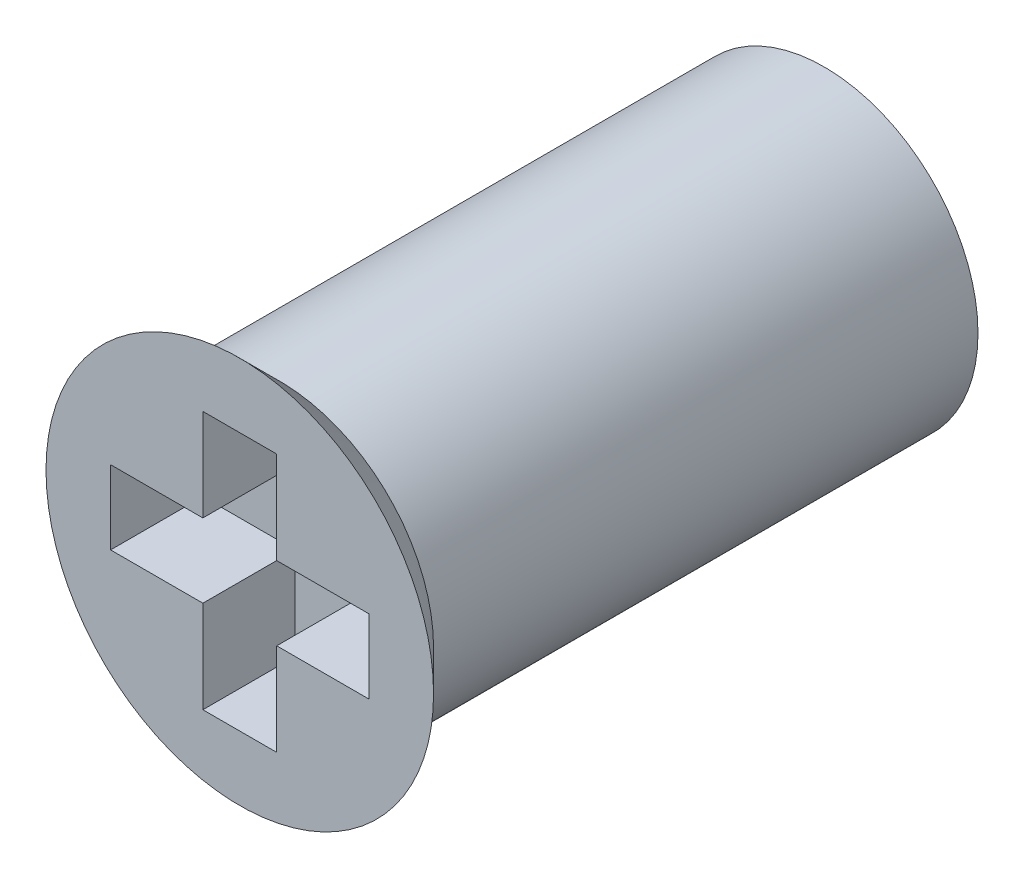
ISO-10303-21;
HEADER;
FILE_DESCRIPTION(('STEP AP214'),'2;1');
FILE_NAME('part.step','',(''),(''),'','','');
FILE_SCHEMA(('AUTOMOTIVE_DESIGN { 1 0 10303 214 1 1 1 1 }'));
ENDSEC;
DATA;
#1=APPLICATION_CONTEXT('core data for automotive mechanical design processes');
#2=APPLICATION_PROTOCOL_DEFINITION('international standard','automotive_design',2000,#1);
#3=PRODUCT_CONTEXT('',#1,'mechanical');
#4=PRODUCT('Part','Part','',(#3));
#5=PRODUCT_RELATED_PRODUCT_CATEGORY('part','',(#4));
#6=PRODUCT_DEFINITION_FORMATION('','',#4);
#7=PRODUCT_DEFINITION_CONTEXT('part definition',#1,'design');
#8=PRODUCT_DEFINITION('design','',#6,#7);
#9=PRODUCT_DEFINITION_SHAPE('','',#8);
#10=(LENGTH_UNIT() NAMED_UNIT(*) SI_UNIT(.MILLI.,.METRE.));
#11=(NAMED_UNIT(*) PLANE_ANGLE_UNIT() SI_UNIT($,.RADIAN.));
#12=(NAMED_UNIT(*) SI_UNIT($,.STERADIAN.) SOLID_ANGLE_UNIT());
#13=UNCERTAINTY_MEASURE_WITH_UNIT(LENGTH_MEASURE(1.E-05),#10,'distance_accuracy_value','');
#14=(GEOMETRIC_REPRESENTATION_CONTEXT(3) GLOBAL_UNCERTAINTY_ASSIGNED_CONTEXT((#13)) GLOBAL_UNIT_ASSIGNED_CONTEXT((#10,
#11,#12)) REPRESENTATION_CONTEXT('',''));
#15=CARTESIAN_POINT('',(0.,0.,0.));
#16=DIRECTION('',(0.,0.,1.));
#17=DIRECTION('',(1.,0.,0.));
#18=AXIS2_PLACEMENT_3D('',#15,#16,#17);
#19=CARTESIAN_POINT('',(0.,0.,8.));
#20=DIRECTION('',(0.,0.,-1.));
#21=DIRECTION('',(-1.,0.,0.));
#22=AXIS2_PLACEMENT_3D('',#19,#20,#21);
#23=CYLINDRICAL_SURFACE('',#22,2.5);
#24=CARTESIAN_POINT('',(0.,0.,8.85000000000002));
#25=DIRECTION('',(0.,0.,1.));
#26=DIRECTION('',(1.,0.,0.));
#27=AXIS2_PLACEMENT_3D('',#24,#25,#26);
#28=CIRCLE('',#27,2.5);
#29=CARTESIAN_POINT('',(2.5,0.,8.85000000000002));
#30=VERTEX_POINT('',#29);
#31=EDGE_CURVE('E11',#30,#30,#28,.F.);
#32=ORIENTED_EDGE('',*,*,#31,.T.);
#33=EDGE_LOOP('',(#32));
#34=FACE_BOUND('',#33,.T.);
#35=CARTESIAN_POINT('',(0.,0.,0.));
#36=DIRECTION('',(0.,0.,1.));
#37=DIRECTION('',(1.,0.,0.));
#38=AXIS2_PLACEMENT_3D('',#35,#36,#37);
#39=CIRCLE('',#38,2.5);
#40=CARTESIAN_POINT('',(2.5,0.,0.));
#41=VERTEX_POINT('',#40);
#42=EDGE_CURVE('E45',#41,#41,#39,.T.);
#43=ORIENTED_EDGE('',*,*,#42,.T.);
#44=EDGE_LOOP('',(#43));
#45=FACE_BOUND('',#44,.T.);
#46=ADVANCED_FACE('F36',(#34,#45),#23,.T.);
#47=CARTESIAN_POINT('',(0.,0.,0.));
#48=DIRECTION('',(0.,0.,1.));
#49=DIRECTION('',(1.,0.,0.));
#50=AXIS2_PLACEMENT_3D('',#47,#48,#49);
#51=PLANE('',#50);
#52=ORIENTED_EDGE('',*,*,#42,.F.);
#53=EDGE_LOOP('',(#52));
#54=FACE_BOUND('',#53,.T.);
#55=ADVANCED_FACE('F216',(#54),#51,.F.);
#56=CARTESIAN_POINT('',(0.,0.,9.5));
#57=DIRECTION('',(0.,0.,1.));
#58=DIRECTION('',(1.,0.,0.));
#59=AXIS2_PLACEMENT_3D('',#56,#57,#58);
#60=PLANE('',#59);
#61=DIRECTION('',(0.,1.,0.));
#62=VECTOR('',#61,1.);
#63=CARTESIAN_POINT('',(0.6,2.1,9.5));
#64=LINE('',#63,#62);
#65=CARTESIAN_POINT('',(0.6,0.6,9.5));
#66=VERTEX_POINT('',#65);
#67=CARTESIAN_POINT('',(0.6,2.1,9.5));
#68=VERTEX_POINT('',#67);
#69=EDGE_CURVE('E52',#66,#68,#64,.T.);
#70=ORIENTED_EDGE('',*,*,#69,.F.);
#71=DIRECTION('',(-1.,0.,0.));
#72=VECTOR('',#71,1.);
#73=CARTESIAN_POINT('',(0.6,0.6,9.5));
#74=LINE('',#73,#72);
#75=CARTESIAN_POINT('',(2.1,0.6,9.5));
#76=VERTEX_POINT('',#75);
#77=EDGE_CURVE('E189',#76,#66,#74,.T.);
#78=ORIENTED_EDGE('',*,*,#77,.F.);
#79=DIRECTION('',(0.,1.,0.));
#80=VECTOR('',#79,1.);
#81=CARTESIAN_POINT('',(2.1,0.6,9.5));
#82=LINE('',#81,#80);
#83=CARTESIAN_POINT('',(2.1,-0.6,9.5));
#84=VERTEX_POINT('',#83);
#85=EDGE_CURVE('E187',#84,#76,#82,.T.);
#86=ORIENTED_EDGE('',*,*,#85,.F.);
#87=DIRECTION('',(1.,0.,0.));
#88=VECTOR('',#87,1.);
#89=CARTESIAN_POINT('',(2.1,-0.6,9.5));
#90=LINE('',#89,#88);
#91=CARTESIAN_POINT('',(0.6,-0.6,9.5));
#92=VERTEX_POINT('',#91);
#93=EDGE_CURVE('E136',#92,#84,#90,.T.);
#94=ORIENTED_EDGE('',*,*,#93,.F.);
#95=DIRECTION('',(0.,1.,0.));
#96=VECTOR('',#95,1.);
#97=CARTESIAN_POINT('',(0.6,-0.6,9.5));
#98=LINE('',#97,#96);
#99=CARTESIAN_POINT('',(0.6,-2.1,9.5));
#100=VERTEX_POINT('',#99);
#101=EDGE_CURVE('E183',#100,#92,#98,.T.);
#102=ORIENTED_EDGE('',*,*,#101,.F.);
#103=DIRECTION('',(1.,0.,0.));
#104=VECTOR('',#103,1.);
#105=CARTESIAN_POINT('',(0.6,-2.1,9.5));
#106=LINE('',#105,#104);
#107=CARTESIAN_POINT('',(-0.6,-2.1,9.5));
#108=VERTEX_POINT('',#107);
#109=EDGE_CURVE('E180',#108,#100,#106,.T.);
#110=ORIENTED_EDGE('',*,*,#109,.F.);
#111=DIRECTION('',(0.,-1.,0.));
#112=VECTOR('',#111,1.);
#113=CARTESIAN_POINT('',(-0.6,-2.1,9.5));
#114=LINE('',#113,#112);
#115=CARTESIAN_POINT('',(-0.6,-0.6,9.5));
#116=VERTEX_POINT('',#115);
#117=EDGE_CURVE('E177',#116,#108,#114,.T.);
#118=ORIENTED_EDGE('',*,*,#117,.F.);
#119=DIRECTION('',(1.,0.,0.));
#120=VECTOR('',#119,1.);
#121=CARTESIAN_POINT('',(-0.6,-0.6,9.5));
#122=LINE('',#121,#120);
#123=CARTESIAN_POINT('',(-2.1,-0.6,9.5));
#124=VERTEX_POINT('',#123);
#125=EDGE_CURVE('E174',#124,#116,#122,.T.);
#126=ORIENTED_EDGE('',*,*,#125,.F.);
#127=DIRECTION('',(0.,-1.,0.));
#128=VECTOR('',#127,1.);
#129=CARTESIAN_POINT('',(-2.1,-0.6,9.5));
#130=LINE('',#129,#128);
#131=CARTESIAN_POINT('',(-2.1,0.6,9.5));
#132=VERTEX_POINT('',#131);
#133=EDGE_CURVE('E171',#132,#124,#130,.T.);
#134=ORIENTED_EDGE('',*,*,#133,.F.);
#135=DIRECTION('',(-1.,0.,0.));
#136=VECTOR('',#135,1.);
#137=CARTESIAN_POINT('',(-2.1,0.6,9.5));
#138=LINE('',#137,#136);
#139=CARTESIAN_POINT('',(-0.6,0.6,9.5));
#140=VERTEX_POINT('',#139);
#141=EDGE_CURVE('E168',#140,#132,#138,.T.);
#142=ORIENTED_EDGE('',*,*,#141,.F.);
#143=DIRECTION('',(0.,-1.,0.));
#144=VECTOR('',#143,1.);
#145=CARTESIAN_POINT('',(-0.6,0.6,9.5));
#146=LINE('',#145,#144);
#147=CARTESIAN_POINT('',(-0.6,2.1,9.5));
#148=VERTEX_POINT('',#147);
#149=EDGE_CURVE('E165',#148,#140,#146,.T.);
#150=ORIENTED_EDGE('',*,*,#149,.F.);
#151=DIRECTION('',(-1.,0.,0.));
#152=VECTOR('',#151,1.);
#153=CARTESIAN_POINT('',(-0.6,2.1,9.5));
#154=LINE('',#153,#152);
#155=EDGE_CURVE('E162',#68,#148,#154,.T.);
#156=ORIENTED_EDGE('',*,*,#155,.F.);
#157=EDGE_LOOP('',(#70,#78,#86,#94,#102,#110,#118,#126,#134,#142,#150,#156));
#158=FACE_BOUND('',#157,.T.);
#159=CARTESIAN_POINT('',(0.,0.,9.5));
#160=DIRECTION('',(0.,0.,1.));
#161=DIRECTION('',(1.,0.,0.));
#162=AXIS2_PLACEMENT_3D('',#159,#160,#161);
#163=CIRCLE('',#162,3.15);
#164=CARTESIAN_POINT('',(3.15,0.,9.5));
#165=VERTEX_POINT('',#164);
#166=EDGE_CURVE('E193',#165,#165,#163,.T.);
#167=ORIENTED_EDGE('',*,*,#166,.T.);
#168=EDGE_LOOP('',(#167));
#169=FACE_BOUND('',#168,.T.);
#170=ADVANCED_FACE('F218',(#158,#169),#60,.T.);
#171=CARTESIAN_POINT('',(0.,0.,9.50000000000003));
#172=DIRECTION('',(0.,0.,1.));
#173=DIRECTION('',(1.,0.,0.));
#174=AXIS2_PLACEMENT_3D('',#171,#172,#173);
#175=CONICAL_SURFACE('',#174,3.15,0.785398163397443);
#176=ORIENTED_EDGE('',*,*,#31,.F.);
#177=EDGE_LOOP('',(#176));
#178=FACE_BOUND('',#177,.T.);
#179=ORIENTED_EDGE('',*,*,#166,.F.);
#180=EDGE_LOOP('',(#179));
#181=FACE_BOUND('',#180,.T.);
#182=ADVANCED_FACE('F39',(#178,#181),#175,.T.);
#183=CARTESIAN_POINT('',(0.6,2.1,8.));
#184=DIRECTION('',(1.,0.,0.));
#185=DIRECTION('',(0.,1.,0.));
#186=AXIS2_PLACEMENT_3D('',#183,#184,#185);
#187=PLANE('',#186);
#188=ORIENTED_EDGE('',*,*,#69,.T.);
#189=DIRECTION('',(0.,0.,1.));
#190=VECTOR('',#189,1.);
#191=CARTESIAN_POINT('',(0.6,2.1,8.));
#192=LINE('',#191,#190);
#193=CARTESIAN_POINT('',(0.6,2.1,8.));
#194=VERTEX_POINT('',#193);
#195=EDGE_CURVE('E100',#194,#68,#192,.T.);
#196=ORIENTED_EDGE('',*,*,#195,.F.);
#197=DIRECTION('',(0.,1.,0.));
#198=VECTOR('',#197,1.);
#199=CARTESIAN_POINT('',(0.6,2.1,8.));
#200=LINE('',#199,#198);
#201=CARTESIAN_POINT('',(0.6,0.6,8.));
#202=VERTEX_POINT('',#201);
#203=EDGE_CURVE('E191',#202,#194,#200,.T.);
#204=ORIENTED_EDGE('',*,*,#203,.F.);
#205=DIRECTION('',(0.,0.,1.));
#206=VECTOR('',#205,1.);
#207=CARTESIAN_POINT('',(0.6,0.6,8.));
#208=LINE('',#207,#206);
#209=EDGE_CURVE('E60',#202,#66,#208,.T.);
#210=ORIENTED_EDGE('',*,*,#209,.T.);
#211=EDGE_LOOP('',(#188,#196,#204,#210));
#212=FACE_BOUND('',#211,.T.);
#213=ADVANCED_FACE('F228',(#212),#187,.F.);
#214=CARTESIAN_POINT('',(0.6,0.6,8.));
#215=DIRECTION('',(0.,1.,0.));
#216=DIRECTION('',(0.,0.,1.));
#217=AXIS2_PLACEMENT_3D('',#214,#215,#216);
#218=PLANE('',#217);
#219=ORIENTED_EDGE('',*,*,#77,.T.);
#220=ORIENTED_EDGE('',*,*,#209,.F.);
#221=DIRECTION('',(-1.,0.,0.));
#222=VECTOR('',#221,1.);
#223=CARTESIAN_POINT('',(0.6,0.6,8.));
#224=LINE('',#223,#222);
#225=CARTESIAN_POINT('',(2.1,0.6,8.));
#226=VERTEX_POINT('',#225);
#227=EDGE_CURVE('E148',#226,#202,#224,.T.);
#228=ORIENTED_EDGE('',*,*,#227,.F.);
#229=DIRECTION('',(0.,0.,1.));
#230=VECTOR('',#229,1.);
#231=CARTESIAN_POINT('',(2.1,0.6,8.));
#232=LINE('',#231,#230);
#233=EDGE_CURVE('E140',#226,#76,#232,.T.);
#234=ORIENTED_EDGE('',*,*,#233,.T.);
#235=EDGE_LOOP('',(#219,#220,#228,#234));
#236=FACE_BOUND('',#235,.T.);
#237=ADVANCED_FACE('F231',(#236),#218,.F.);
#238=CARTESIAN_POINT('',(2.1,0.6,8.));
#239=DIRECTION('',(1.,0.,0.));
#240=DIRECTION('',(0.,1.,0.));
#241=AXIS2_PLACEMENT_3D('',#238,#239,#240);
#242=PLANE('',#241);
#243=ORIENTED_EDGE('',*,*,#85,.T.);
#244=ORIENTED_EDGE('',*,*,#233,.F.);
#245=DIRECTION('',(0.,1.,0.));
#246=VECTOR('',#245,1.);
#247=CARTESIAN_POINT('',(2.1,0.6,8.));
#248=LINE('',#247,#246);
#249=CARTESIAN_POINT('',(2.1,-0.6,8.));
#250=VERTEX_POINT('',#249);
#251=EDGE_CURVE('E144',#250,#226,#248,.T.);
#252=ORIENTED_EDGE('',*,*,#251,.F.);
#253=DIRECTION('',(0.,0.,1.));
#254=VECTOR('',#253,1.);
#255=CARTESIAN_POINT('',(2.1,-0.6,8.));
#256=LINE('',#255,#254);
#257=EDGE_CURVE('E129',#250,#84,#256,.T.);
#258=ORIENTED_EDGE('',*,*,#257,.T.);
#259=EDGE_LOOP('',(#243,#244,#252,#258));
#260=FACE_BOUND('',#259,.T.);
#261=ADVANCED_FACE('F145',(#260),#242,.F.);
#262=CARTESIAN_POINT('',(2.1,-0.6,8.));
#263=DIRECTION('',(0.,-1.,0.));
#264=DIRECTION('',(0.,0.,-1.));
#265=AXIS2_PLACEMENT_3D('',#262,#263,#264);
#266=PLANE('',#265);
#267=ORIENTED_EDGE('',*,*,#93,.T.);
#268=ORIENTED_EDGE('',*,*,#257,.F.);
#269=DIRECTION('',(1.,0.,0.));
#270=VECTOR('',#269,1.);
#271=CARTESIAN_POINT('',(2.1,-0.6,8.));
#272=LINE('',#271,#270);
#273=CARTESIAN_POINT('',(0.6,-0.6,8.));
#274=VERTEX_POINT('',#273);
#275=EDGE_CURVE('E133',#274,#250,#272,.T.);
#276=ORIENTED_EDGE('',*,*,#275,.F.);
#277=DIRECTION('',(0.,0.,1.));
#278=VECTOR('',#277,1.);
#279=CARTESIAN_POINT('',(0.6,-0.6,8.));
#280=LINE('',#279,#278);
#281=EDGE_CURVE('E141',#274,#92,#280,.T.);
#282=ORIENTED_EDGE('',*,*,#281,.T.);
#283=EDGE_LOOP('',(#267,#268,#276,#282));
#284=FACE_BOUND('',#283,.T.);
#285=ADVANCED_FACE('F131',(#284),#266,.F.);
#286=CARTESIAN_POINT('',(0.6,-0.6,8.));
#287=DIRECTION('',(1.,0.,0.));
#288=DIRECTION('',(0.,1.,0.));
#289=AXIS2_PLACEMENT_3D('',#286,#287,#288);
#290=PLANE('',#289);
#291=ORIENTED_EDGE('',*,*,#101,.T.);
#292=ORIENTED_EDGE('',*,*,#281,.F.);
#293=DIRECTION('',(0.,1.,0.));
#294=VECTOR('',#293,1.);
#295=CARTESIAN_POINT('',(0.6,-0.6,8.));
#296=LINE('',#295,#294);
#297=CARTESIAN_POINT('',(0.6,-2.1,8.));
#298=VERTEX_POINT('',#297);
#299=EDGE_CURVE('E154',#298,#274,#296,.T.);
#300=ORIENTED_EDGE('',*,*,#299,.F.);
#301=DIRECTION('',(0.,0.,1.));
#302=VECTOR('',#301,1.);
#303=CARTESIAN_POINT('',(0.6,-2.1,8.));
#304=LINE('',#303,#302);
#305=EDGE_CURVE('E196',#298,#100,#304,.T.);
#306=ORIENTED_EDGE('',*,*,#305,.T.);
#307=EDGE_LOOP('',(#291,#292,#300,#306));
#308=FACE_BOUND('',#307,.T.);
#309=ADVANCED_FACE('F259',(#308),#290,.F.);
#310=CARTESIAN_POINT('',(0.6,-2.1,8.));
#311=DIRECTION('',(0.,-1.,0.));
#312=DIRECTION('',(0.,0.,-1.));
#313=AXIS2_PLACEMENT_3D('',#310,#311,#312);
#314=PLANE('',#313);
#315=ORIENTED_EDGE('',*,*,#109,.T.);
#316=ORIENTED_EDGE('',*,*,#305,.F.);
#317=DIRECTION('',(1.,0.,0.));
#318=VECTOR('',#317,1.);
#319=CARTESIAN_POINT('',(0.6,-2.1,8.));
#320=LINE('',#319,#318);
#321=CARTESIAN_POINT('',(-0.6,-2.1,8.));
#322=VERTEX_POINT('',#321);
#323=EDGE_CURVE('E156',#322,#298,#320,.T.);
#324=ORIENTED_EDGE('',*,*,#323,.F.);
#325=DIRECTION('',(0.,0.,1.));
#326=VECTOR('',#325,1.);
#327=CARTESIAN_POINT('',(-0.6,-2.1,8.));
#328=LINE('',#327,#326);
#329=EDGE_CURVE('E198',#322,#108,#328,.T.);
#330=ORIENTED_EDGE('',*,*,#329,.T.);
#331=EDGE_LOOP('',(#315,#316,#324,#330));
#332=FACE_BOUND('',#331,.T.);
#333=ADVANCED_FACE('F255',(#332),#314,.F.);
#334=CARTESIAN_POINT('',(-0.6,-2.1,8.));
#335=DIRECTION('',(-1.,0.,0.));
#336=DIRECTION('',(0.,0.,1.));
#337=AXIS2_PLACEMENT_3D('',#334,#335,#336);
#338=PLANE('',#337);
#339=ORIENTED_EDGE('',*,*,#117,.T.);
#340=ORIENTED_EDGE('',*,*,#329,.F.);
#341=DIRECTION('',(0.,-1.,0.));
#342=VECTOR('',#341,1.);
#343=CARTESIAN_POINT('',(-0.6,-2.1,8.));
#344=LINE('',#343,#342);
#345=CARTESIAN_POINT('',(-0.6,-0.6,8.));
#346=VERTEX_POINT('',#345);
#347=EDGE_CURVE('E399',#346,#322,#344,.T.);
#348=ORIENTED_EDGE('',*,*,#347,.F.);
#349=DIRECTION('',(0.,0.,1.));
#350=VECTOR('',#349,1.);
#351=CARTESIAN_POINT('',(-0.6,-0.6,8.));
#352=LINE('',#351,#350);
#353=EDGE_CURVE('E200',#346,#116,#352,.T.);
#354=ORIENTED_EDGE('',*,*,#353,.T.);
#355=EDGE_LOOP('',(#339,#340,#348,#354));
#356=FACE_BOUND('',#355,.T.);
#357=ADVANCED_FACE('F251',(#356),#338,.F.);
#358=CARTESIAN_POINT('',(-0.6,-0.6,8.));
#359=DIRECTION('',(0.,-1.,0.));
#360=DIRECTION('',(1.,0.,0.));
#361=AXIS2_PLACEMENT_3D('',#358,#359,#360);
#362=PLANE('',#361);
#363=ORIENTED_EDGE('',*,*,#125,.T.);
#364=ORIENTED_EDGE('',*,*,#353,.F.);
#365=DIRECTION('',(1.,0.,0.));
#366=VECTOR('',#365,1.);
#367=CARTESIAN_POINT('',(-0.6,-0.6,8.));
#368=LINE('',#367,#366);
#369=CARTESIAN_POINT('',(-2.1,-0.6,8.));
#370=VERTEX_POINT('',#369);
#371=EDGE_CURVE('E396',#370,#346,#368,.T.);
#372=ORIENTED_EDGE('',*,*,#371,.F.);
#373=DIRECTION('',(0.,0.,1.));
#374=VECTOR('',#373,1.);
#375=CARTESIAN_POINT('',(-2.1,-0.6,8.));
#376=LINE('',#375,#374);
#377=EDGE_CURVE('E202',#370,#124,#376,.T.);
#378=ORIENTED_EDGE('',*,*,#377,.T.);
#379=EDGE_LOOP('',(#363,#364,#372,#378));
#380=FACE_BOUND('',#379,.T.);
#381=ADVANCED_FACE('F247',(#380),#362,.F.);
#382=CARTESIAN_POINT('',(-2.1,-0.6,8.));
#383=DIRECTION('',(-1.,0.,0.));
#384=DIRECTION('',(0.,0.,1.));
#385=AXIS2_PLACEMENT_3D('',#382,#383,#384);
#386=PLANE('',#385);
#387=ORIENTED_EDGE('',*,*,#133,.T.);
#388=ORIENTED_EDGE('',*,*,#377,.F.);
#389=DIRECTION('',(0.,-1.,0.));
#390=VECTOR('',#389,1.);
#391=CARTESIAN_POINT('',(-2.1,-0.6,8.));
#392=LINE('',#391,#390);
#393=CARTESIAN_POINT('',(-2.1,0.6,8.));
#394=VERTEX_POINT('',#393);
#395=EDGE_CURVE('E393',#394,#370,#392,.T.);
#396=ORIENTED_EDGE('',*,*,#395,.F.);
#397=DIRECTION('',(0.,0.,1.));
#398=VECTOR('',#397,1.);
#399=CARTESIAN_POINT('',(-2.1,0.6,8.));
#400=LINE('',#399,#398);
#401=EDGE_CURVE('E204',#394,#132,#400,.T.);
#402=ORIENTED_EDGE('',*,*,#401,.T.);
#403=EDGE_LOOP('',(#387,#388,#396,#402));
#404=FACE_BOUND('',#403,.T.);
#405=ADVANCED_FACE('F243',(#404),#386,.F.);
#406=CARTESIAN_POINT('',(-2.1,0.6,8.));
#407=DIRECTION('',(0.,1.,0.));
#408=DIRECTION('',(0.,0.,1.));
#409=AXIS2_PLACEMENT_3D('',#406,#407,#408);
#410=PLANE('',#409);
#411=ORIENTED_EDGE('',*,*,#141,.T.);
#412=ORIENTED_EDGE('',*,*,#401,.F.);
#413=DIRECTION('',(-1.,0.,0.));
#414=VECTOR('',#413,1.);
#415=CARTESIAN_POINT('',(-2.1,0.6,8.));
#416=LINE('',#415,#414);
#417=CARTESIAN_POINT('',(-0.6,0.6,8.));
#418=VERTEX_POINT('',#417);
#419=EDGE_CURVE('E390',#418,#394,#416,.T.);
#420=ORIENTED_EDGE('',*,*,#419,.F.);
#421=DIRECTION('',(0.,0.,1.));
#422=VECTOR('',#421,1.);
#423=CARTESIAN_POINT('',(-0.6,0.6,8.));
#424=LINE('',#423,#422);
#425=EDGE_CURVE('E206',#418,#140,#424,.T.);
#426=ORIENTED_EDGE('',*,*,#425,.T.);
#427=EDGE_LOOP('',(#411,#412,#420,#426));
#428=FACE_BOUND('',#427,.T.);
#429=ADVANCED_FACE('F239',(#428),#410,.F.);
#430=CARTESIAN_POINT('',(-0.6,0.6,8.));
#431=DIRECTION('',(-1.,0.,0.));
#432=DIRECTION('',(0.,0.,1.));
#433=AXIS2_PLACEMENT_3D('',#430,#431,#432);
#434=PLANE('',#433);
#435=ORIENTED_EDGE('',*,*,#149,.T.);
#436=ORIENTED_EDGE('',*,*,#425,.F.);
#437=DIRECTION('',(0.,-1.,0.));
#438=VECTOR('',#437,1.);
#439=CARTESIAN_POINT('',(-0.6,0.6,8.));
#440=LINE('',#439,#438);
#441=CARTESIAN_POINT('',(-0.6,2.1,8.));
#442=VERTEX_POINT('',#441);
#443=EDGE_CURVE('E385',#442,#418,#440,.T.);
#444=ORIENTED_EDGE('',*,*,#443,.F.);
#445=DIRECTION('',(0.,0.,1.));
#446=VECTOR('',#445,1.);
#447=CARTESIAN_POINT('',(-0.6,2.1,8.));
#448=LINE('',#447,#446);
#449=EDGE_CURVE('E208',#442,#148,#448,.T.);
#450=ORIENTED_EDGE('',*,*,#449,.T.);
#451=EDGE_LOOP('',(#435,#436,#444,#450));
#452=FACE_BOUND('',#451,.T.);
#453=ADVANCED_FACE('F235',(#452),#434,.F.);
#454=CARTESIAN_POINT('',(-0.6,2.1,8.));
#455=DIRECTION('',(0.,1.,0.));
#456=DIRECTION('',(0.,0.,1.));
#457=AXIS2_PLACEMENT_3D('',#454,#455,#456);
#458=PLANE('',#457);
#459=ORIENTED_EDGE('',*,*,#155,.T.);
#460=ORIENTED_EDGE('',*,*,#449,.F.);
#461=DIRECTION('',(-1.,0.,0.));
#462=VECTOR('',#461,1.);
#463=CARTESIAN_POINT('',(-0.6,2.1,8.));
#464=LINE('',#463,#462);
#465=EDGE_CURVE('E383',#194,#442,#464,.T.);
#466=ORIENTED_EDGE('',*,*,#465,.F.);
#467=ORIENTED_EDGE('',*,*,#195,.T.);
#468=EDGE_LOOP('',(#459,#460,#466,#467));
#469=FACE_BOUND('',#468,.T.);
#470=ADVANCED_FACE('F232',(#469),#458,.F.);
#471=CARTESIAN_POINT('',(0.,0.,8.));
#472=DIRECTION('',(0.,0.,1.));
#473=DIRECTION('',(1.,0.,0.));
#474=AXIS2_PLACEMENT_3D('',#471,#472,#473);
#475=PLANE('',#474);
#476=ORIENTED_EDGE('',*,*,#203,.T.);
#477=ORIENTED_EDGE('',*,*,#465,.T.);
#478=ORIENTED_EDGE('',*,*,#443,.T.);
#479=ORIENTED_EDGE('',*,*,#419,.T.);
#480=ORIENTED_EDGE('',*,*,#395,.T.);
#481=ORIENTED_EDGE('',*,*,#371,.T.);
#482=ORIENTED_EDGE('',*,*,#347,.T.);
#483=ORIENTED_EDGE('',*,*,#323,.T.);
#484=ORIENTED_EDGE('',*,*,#299,.T.);
#485=ORIENTED_EDGE('',*,*,#275,.T.);
#486=ORIENTED_EDGE('',*,*,#251,.T.);
#487=ORIENTED_EDGE('',*,*,#227,.T.);
#488=EDGE_LOOP('',(#476,#477,#478,#479,#480,#481,#482,#483,#484,#485,#486,#487));
#489=FACE_BOUND('',#488,.T.);
#490=ADVANCED_FACE('F151',(#489),#475,.T.);
#491=CLOSED_SHELL('',(#46,#55,#170,#182,#213,#237,#261,#285,#309,#333,#357,#381,#405,#429,#453,
#470,#490));
#492=MANIFOLD_SOLID_BREP('B2',#491);
#493=ADVANCED_BREP_SHAPE_REPRESENTATION('',(#18,#492),#14);
#494=SHAPE_DEFINITION_REPRESENTATION(#9,#493);
ENDSEC;
END-ISO-10303-21;
